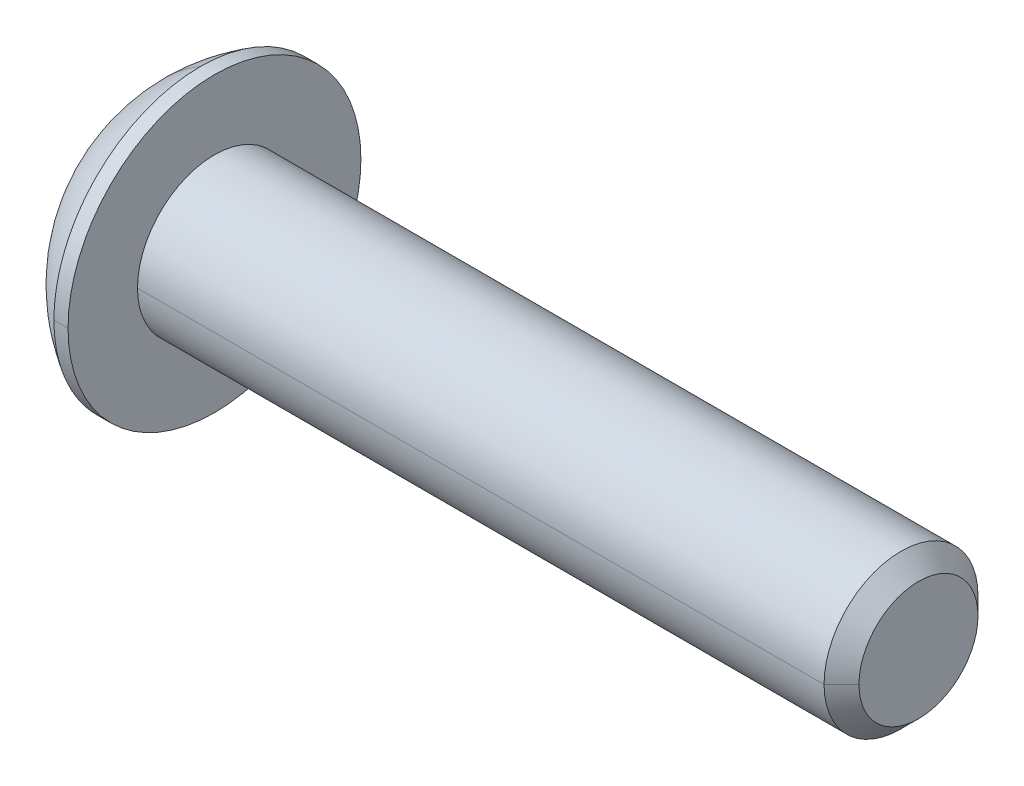
ISO-10303-21;
HEADER;
FILE_DESCRIPTION(('STEP AP214'),'2;1');
FILE_NAME('part.step','',(''),(''),'','','');
FILE_SCHEMA(('AUTOMOTIVE_DESIGN { 1 0 10303 214 1 1 1 1 }'));
ENDSEC;
DATA;
#1=APPLICATION_CONTEXT('core data for automotive mechanical design processes');
#2=APPLICATION_PROTOCOL_DEFINITION('international standard','automotive_design',2000,#1);
#3=PRODUCT_CONTEXT('',#1,'mechanical');
#4=PRODUCT('Part','Part','',(#3));
#5=PRODUCT_RELATED_PRODUCT_CATEGORY('part','',(#4));
#6=PRODUCT_DEFINITION_FORMATION('','',#4);
#7=PRODUCT_DEFINITION_CONTEXT('part definition',#1,'design');
#8=PRODUCT_DEFINITION('design','',#6,#7);
#9=PRODUCT_DEFINITION_SHAPE('','',#8);
#10=(LENGTH_UNIT() NAMED_UNIT(*) SI_UNIT(.MILLI.,.METRE.));
#11=(NAMED_UNIT(*) PLANE_ANGLE_UNIT() SI_UNIT($,.RADIAN.));
#12=(NAMED_UNIT(*) SI_UNIT($,.STERADIAN.) SOLID_ANGLE_UNIT());
#13=UNCERTAINTY_MEASURE_WITH_UNIT(LENGTH_MEASURE(1.E-05),#10,'distance_accuracy_value','');
#14=(GEOMETRIC_REPRESENTATION_CONTEXT(3) GLOBAL_UNCERTAINTY_ASSIGNED_CONTEXT((#13)) GLOBAL_UNIT_ASSIGNED_CONTEXT((#10,
#11,#12)) REPRESENTATION_CONTEXT('',''));
#15=CARTESIAN_POINT('',(0.,0.,0.));
#16=DIRECTION('',(0.,0.,1.));
#17=DIRECTION('',(1.,0.,0.));
#18=AXIS2_PLACEMENT_3D('',#15,#16,#17);
#19=CARTESIAN_POINT('',(21.2598,0.,0.));
#20=DIRECTION('',(-1.,0.,0.));
#21=DIRECTION('',(0.,0.,1.));
#22=AXIS2_PLACEMENT_3D('',#19,#20,#21);
#23=PLANE('',#22);
#24=CARTESIAN_POINT('',(21.2598,0.,0.));
#25=DIRECTION('',(-1.,0.,0.));
#26=DIRECTION('',(0.,0.,1.));
#27=AXIS2_PLACEMENT_3D('',#24,#25,#26);
#28=CIRCLE('',#27,1.61036);
#29=CARTESIAN_POINT('',(21.2598,0.,1.61036));
#30=VERTEX_POINT('',#29);
#31=CARTESIAN_POINT('',(21.2598,0.,-1.61036));
#32=VERTEX_POINT('',#31);
#33=EDGE_CURVE('E11',#30,#32,#28,.T.);
#34=ORIENTED_EDGE('',*,*,#33,.F.);
#35=CARTESIAN_POINT('',(21.2598,0.,0.));
#36=DIRECTION('',(-1.,0.,0.));
#37=DIRECTION('',(0.,0.,1.));
#38=AXIS2_PLACEMENT_3D('',#35,#36,#37);
#39=CIRCLE('',#38,1.61036);
#40=EDGE_CURVE('E221',#32,#30,#39,.T.);
#41=ORIENTED_EDGE('',*,*,#40,.F.);
#42=EDGE_LOOP('',(#34,#41));
#43=FACE_BOUND('',#42,.T.);
#44=ADVANCED_FACE('F17',(#43),#23,.F.);
#45=CARTESIAN_POINT('',(21.2598,0.,0.));
#46=DIRECTION('',(-1.,0.,0.));
#47=DIRECTION('',(0.,0.,1.));
#48=AXIS2_PLACEMENT_3D('',#45,#46,#47);
#49=CONICAL_SURFACE('',#48,1.61036,0.785398163397444);
#50=ORIENTED_EDGE('',*,*,#33,.T.);
#51=DIRECTION('',(-0.707106781186551,0.,-0.707106781186545));
#52=VECTOR('',#51,1.);
#53=CARTESIAN_POINT('',(21.2598,0.,-1.61036));
#54=LINE('',#53,#52);
#55=CARTESIAN_POINT('',(20.78736,0.,-2.0828));
#56=VERTEX_POINT('',#55);
#57=EDGE_CURVE('E218',#32,#56,#54,.T.);
#58=ORIENTED_EDGE('',*,*,#57,.T.);
#59=CARTESIAN_POINT('',(20.78736,0.,0.));
#60=DIRECTION('',(-1.,0.,0.));
#61=DIRECTION('',(0.,0.,1.));
#62=AXIS2_PLACEMENT_3D('',#59,#60,#61);
#63=CIRCLE('',#62,2.0828);
#64=CARTESIAN_POINT('',(20.78736,0.,2.0828));
#65=VERTEX_POINT('',#64);
#66=EDGE_CURVE('E222',#65,#56,#63,.T.);
#67=ORIENTED_EDGE('',*,*,#66,.F.);
#68=DIRECTION('',(-0.707106781186551,0.,0.707106781186545));
#69=VECTOR('',#68,1.);
#70=CARTESIAN_POINT('',(21.2598,0.,1.61036));
#71=LINE('',#70,#69);
#72=EDGE_CURVE('E28',#30,#65,#71,.T.);
#73=ORIENTED_EDGE('',*,*,#72,.F.);
#74=EDGE_LOOP('',(#50,#58,#67,#73));
#75=FACE_BOUND('',#74,.T.);
#76=ADVANCED_FACE('F402',(#75),#49,.T.);
#77=CARTESIAN_POINT('',(21.2598,0.,0.));
#78=DIRECTION('',(-1.,0.,0.));
#79=DIRECTION('',(0.,0.,1.));
#80=AXIS2_PLACEMENT_3D('',#77,#78,#79);
#81=CONICAL_SURFACE('',#80,1.61036,0.785398163397444);
#82=ORIENTED_EDGE('',*,*,#57,.F.);
#83=ORIENTED_EDGE('',*,*,#40,.T.);
#84=ORIENTED_EDGE('',*,*,#72,.T.);
#85=CARTESIAN_POINT('',(20.78736,0.,0.));
#86=DIRECTION('',(-1.,0.,0.));
#87=DIRECTION('',(0.,0.,1.));
#88=AXIS2_PLACEMENT_3D('',#85,#86,#87);
#89=CIRCLE('',#88,2.0828);
#90=EDGE_CURVE('E279',#56,#65,#89,.T.);
#91=ORIENTED_EDGE('',*,*,#90,.F.);
#92=EDGE_LOOP('',(#82,#83,#84,#91));
#93=FACE_BOUND('',#92,.T.);
#94=ADVANCED_FACE('F398',(#93),#81,.T.);
#95=CARTESIAN_POINT('',(0.,0.,0.));
#96=DIRECTION('',(-1.,0.,0.));
#97=DIRECTION('',(0.,0.,1.));
#98=AXIS2_PLACEMENT_3D('',#95,#96,#97);
#99=CYLINDRICAL_SURFACE('',#98,2.0828);
#100=ORIENTED_EDGE('',*,*,#66,.T.);
#101=DIRECTION('',(-1.,0.,0.));
#102=VECTOR('',#101,1.);
#103=CARTESIAN_POINT('',(0.,0.,-2.0828));
#104=LINE('',#103,#102);
#105=CARTESIAN_POINT('',(2.2098,0.,-2.0828));
#106=VERTEX_POINT('',#105);
#107=EDGE_CURVE('E297',#56,#106,#104,.T.);
#108=ORIENTED_EDGE('',*,*,#107,.T.);
#109=CARTESIAN_POINT('',(2.2098,0.,0.));
#110=DIRECTION('',(-1.,0.,0.));
#111=DIRECTION('',(0.,0.,1.));
#112=AXIS2_PLACEMENT_3D('',#109,#110,#111);
#113=CIRCLE('',#112,2.0828);
#114=CARTESIAN_POINT('',(2.2098,0.,2.0828));
#115=VERTEX_POINT('',#114);
#116=EDGE_CURVE('E256',#115,#106,#113,.T.);
#117=ORIENTED_EDGE('',*,*,#116,.F.);
#118=DIRECTION('',(-1.,0.,0.));
#119=VECTOR('',#118,1.);
#120=CARTESIAN_POINT('',(0.,0.,2.0828));
#121=LINE('',#120,#119);
#122=EDGE_CURVE('E249',#65,#115,#121,.T.);
#123=ORIENTED_EDGE('',*,*,#122,.F.);
#124=EDGE_LOOP('',(#100,#108,#117,#123));
#125=FACE_BOUND('',#124,.T.);
#126=ADVANCED_FACE('F405',(#125),#99,.T.);
#127=CARTESIAN_POINT('',(0.,0.,0.));
#128=DIRECTION('',(-1.,0.,0.));
#129=DIRECTION('',(0.,0.,1.));
#130=AXIS2_PLACEMENT_3D('',#127,#128,#129);
#131=CYLINDRICAL_SURFACE('',#130,2.0828);
#132=ORIENTED_EDGE('',*,*,#107,.F.);
#133=ORIENTED_EDGE('',*,*,#90,.T.);
#134=ORIENTED_EDGE('',*,*,#122,.T.);
#135=CARTESIAN_POINT('',(2.2098,0.,0.));
#136=DIRECTION('',(-1.,0.,0.));
#137=DIRECTION('',(0.,0.,1.));
#138=AXIS2_PLACEMENT_3D('',#135,#136,#137);
#139=CIRCLE('',#138,2.0828);
#140=EDGE_CURVE('E259',#106,#115,#139,.T.);
#141=ORIENTED_EDGE('',*,*,#140,.F.);
#142=EDGE_LOOP('',(#132,#133,#134,#141));
#143=FACE_BOUND('',#142,.T.);
#144=ADVANCED_FACE('F408',(#143),#131,.T.);
#145=CARTESIAN_POINT('',(2.2098,2.0828,0.));
#146=DIRECTION('',(-1.,0.,0.));
#147=DIRECTION('',(0.,0.,1.));
#148=AXIS2_PLACEMENT_3D('',#145,#146,#147);
#149=PLANE('',#148);
#150=ORIENTED_EDGE('',*,*,#116,.T.);
#151=ORIENTED_EDGE('',*,*,#140,.T.);
#152=EDGE_LOOP('',(#150,#151));
#153=FACE_BOUND('',#152,.T.);
#154=CARTESIAN_POINT('',(2.2098,0.,0.));
#155=DIRECTION('',(-1.,0.,0.));
#156=DIRECTION('',(0.,0.,1.));
#157=AXIS2_PLACEMENT_3D('',#154,#155,#156);
#158=CIRCLE('',#157,3.9624);
#159=CARTESIAN_POINT('',(2.2098,0.,3.9624));
#160=VERTEX_POINT('',#159);
#161=CARTESIAN_POINT('',(2.2098,0.,-3.9624));
#162=VERTEX_POINT('',#161);
#163=EDGE_CURVE('E255',#160,#162,#158,.T.);
#164=ORIENTED_EDGE('',*,*,#163,.F.);
#165=CARTESIAN_POINT('',(2.2098,0.,0.));
#166=DIRECTION('',(-1.,0.,0.));
#167=DIRECTION('',(0.,0.,1.));
#168=AXIS2_PLACEMENT_3D('',#165,#166,#167);
#169=CIRCLE('',#168,3.9624);
#170=EDGE_CURVE('E230',#162,#160,#169,.T.);
#171=ORIENTED_EDGE('',*,*,#170,.F.);
#172=EDGE_LOOP('',(#164,#171));
#173=FACE_BOUND('',#172,.T.);
#174=ADVANCED_FACE('F637',(#153,#173),#149,.F.);
#175=CARTESIAN_POINT('',(0.,0.,0.));
#176=DIRECTION('',(-1.,0.,0.));
#177=DIRECTION('',(0.,0.,1.));
#178=AXIS2_PLACEMENT_3D('',#175,#176,#177);
#179=CYLINDRICAL_SURFACE('',#178,3.9624);
#180=DIRECTION('',(-1.,0.,0.));
#181=VECTOR('',#180,1.);
#182=CARTESIAN_POINT('',(0.,0.,-3.9624));
#183=LINE('',#182,#181);
#184=CARTESIAN_POINT('',(1.8288,0.,-3.9624));
#185=VERTEX_POINT('',#184);
#186=EDGE_CURVE('E231',#162,#185,#183,.T.);
#187=ORIENTED_EDGE('',*,*,#186,.F.);
#188=ORIENTED_EDGE('',*,*,#170,.T.);
#189=DIRECTION('',(-1.,0.,0.));
#190=VECTOR('',#189,1.);
#191=CARTESIAN_POINT('',(0.,0.,3.9624));
#192=LINE('',#191,#190);
#193=CARTESIAN_POINT('',(1.8288,0.,3.9624));
#194=VERTEX_POINT('',#193);
#195=EDGE_CURVE('E227',#160,#194,#192,.T.);
#196=ORIENTED_EDGE('',*,*,#195,.T.);
#197=CARTESIAN_POINT('',(1.8288,0.,0.));
#198=DIRECTION('',(-1.,0.,0.));
#199=DIRECTION('',(0.,0.,1.));
#200=AXIS2_PLACEMENT_3D('',#197,#198,#199);
#201=CIRCLE('',#200,3.9624);
#202=CARTESIAN_POINT('',(1.8288,-3.9624,0.));
#203=VERTEX_POINT('',#202);
#204=EDGE_CURVE('E329',#203,#194,#201,.T.);
#205=ORIENTED_EDGE('',*,*,#204,.F.);
#206=CARTESIAN_POINT('',(1.8288,0.,0.));
#207=DIRECTION('',(-1.,0.,0.));
#208=DIRECTION('',(0.,0.,1.));
#209=AXIS2_PLACEMENT_3D('',#206,#207,#208);
#210=CIRCLE('',#209,3.9624);
#211=EDGE_CURVE('E214',#185,#203,#210,.T.);
#212=ORIENTED_EDGE('',*,*,#211,.F.);
#213=EDGE_LOOP('',(#187,#188,#196,#205,#212));
#214=FACE_BOUND('',#213,.T.);
#215=ADVANCED_FACE('F591',(#214),#179,.T.);
#216=CARTESIAN_POINT('',(0.,0.,0.));
#217=DIRECTION('',(-1.,0.,0.));
#218=DIRECTION('',(0.,0.,1.));
#219=AXIS2_PLACEMENT_3D('',#216,#217,#218);
#220=CYLINDRICAL_SURFACE('',#219,3.9624);
#221=ORIENTED_EDGE('',*,*,#163,.T.);
#222=ORIENTED_EDGE('',*,*,#186,.T.);
#223=CARTESIAN_POINT('',(1.8288,0.,0.));
#224=DIRECTION('',(-1.,0.,0.));
#225=DIRECTION('',(0.,0.,1.));
#226=AXIS2_PLACEMENT_3D('',#223,#224,#225);
#227=CIRCLE('',#226,3.9624);
#228=CARTESIAN_POINT('',(1.8288,3.9624,0.));
#229=VERTEX_POINT('',#228);
#230=EDGE_CURVE('E268',#229,#185,#227,.T.);
#231=ORIENTED_EDGE('',*,*,#230,.F.);
#232=CARTESIAN_POINT('',(1.8288,0.,0.));
#233=DIRECTION('',(-1.,0.,0.));
#234=DIRECTION('',(0.,0.,1.));
#235=AXIS2_PLACEMENT_3D('',#232,#233,#234);
#236=CIRCLE('',#235,3.9624);
#237=EDGE_CURVE('E325',#194,#229,#236,.T.);
#238=ORIENTED_EDGE('',*,*,#237,.F.);
#239=ORIENTED_EDGE('',*,*,#195,.F.);
#240=EDGE_LOOP('',(#221,#222,#231,#238,#239));
#241=FACE_BOUND('',#240,.T.);
#242=ADVANCED_FACE('F587',(#241),#220,.T.);
#243=CARTESIAN_POINT('',(1.3208,-2.06772225407573,-1.1938));
#244=DIRECTION('',(1.,0.,0.));
#245=DIRECTION('',(0.,1.,0.));
#246=AXIS2_PLACEMENT_3D('',#243,#244,#245);
#247=PLANE('',#246);
#248=CARTESIAN_POINT('',(1.3208,0.,0.));
#249=DIRECTION('',(-1.,0.,0.));
#250=DIRECTION('',(0.,0.,1.));
#251=AXIS2_PLACEMENT_3D('',#248,#249,#250);
#252=CIRCLE('',#251,1.1938);
#253=CARTESIAN_POINT('',(1.3208,-1.03386112703786,-0.5969));
#254=VERTEX_POINT('',#253);
#255=CARTESIAN_POINT('',(1.3208,-1.03386112703786,0.5969));
#256=VERTEX_POINT('',#255);
#257=EDGE_CURVE('E239',#254,#256,#252,.T.);
#258=ORIENTED_EDGE('',*,*,#257,.F.);
#259=DIRECTION('',(0.,0.5,-0.866025403784439));
#260=VECTOR('',#259,1.);
#261=CARTESIAN_POINT('',(1.3208,-0.689240751358574,-1.1938));
#262=LINE('',#261,#260);
#263=CARTESIAN_POINT('',(1.3208,-1.37848150271715,0.));
#264=VERTEX_POINT('',#263);
#265=EDGE_CURVE('E232',#264,#254,#262,.T.);
#266=ORIENTED_EDGE('',*,*,#265,.F.);
#267=DIRECTION('',(0.,-0.5,-0.866025403784439));
#268=VECTOR('',#267,1.);
#269=CARTESIAN_POINT('',(1.3208,-1.37848150271715,0.));
#270=LINE('',#269,#268);
#271=EDGE_CURVE('E125',#256,#264,#270,.T.);
#272=ORIENTED_EDGE('',*,*,#271,.F.);
#273=EDGE_LOOP('',(#258,#266,#272));
#274=FACE_BOUND('',#273,.T.);
#275=ADVANCED_FACE('F561',(#274),#247,.F.);
#276=CARTESIAN_POINT('',(1.3208,-2.06772225407573,-1.1938));
#277=DIRECTION('',(1.,0.,0.));
#278=DIRECTION('',(0.,1.,0.));
#279=AXIS2_PLACEMENT_3D('',#276,#277,#278);
#280=PLANE('',#279);
#281=CARTESIAN_POINT('',(1.3208,0.,0.));
#282=DIRECTION('',(-1.,0.,0.));
#283=DIRECTION('',(0.,0.,1.));
#284=AXIS2_PLACEMENT_3D('',#281,#282,#283);
#285=CIRCLE('',#284,1.1938);
#286=CARTESIAN_POINT('',(1.3208,0.,1.1938));
#287=VERTEX_POINT('',#286);
#288=EDGE_CURVE('E235',#256,#287,#285,.T.);
#289=ORIENTED_EDGE('',*,*,#288,.F.);
#290=DIRECTION('',(0.,-0.5,-0.866025403784439));
#291=VECTOR('',#290,1.);
#292=CARTESIAN_POINT('',(1.3208,-1.37848150271715,0.));
#293=LINE('',#292,#291);
#294=CARTESIAN_POINT('',(1.3208,-0.689240751358574,1.1938));
#295=VERTEX_POINT('',#294);
#296=EDGE_CURVE('E275',#295,#256,#293,.T.);
#297=ORIENTED_EDGE('',*,*,#296,.F.);
#298=DIRECTION('',(0.,-1.,0.));
#299=VECTOR('',#298,1.);
#300=CARTESIAN_POINT('',(1.3208,-0.689240751358574,1.1938));
#301=LINE('',#300,#299);
#302=EDGE_CURVE('E264',#287,#295,#301,.T.);
#303=ORIENTED_EDGE('',*,*,#302,.F.);
#304=EDGE_LOOP('',(#289,#297,#303));
#305=FACE_BOUND('',#304,.T.);
#306=ADVANCED_FACE('F557',(#305),#280,.F.);
#307=CARTESIAN_POINT('',(1.3208,-0.689240751358574,1.1938));
#308=DIRECTION('',(0.,0.,-1.));
#309=DIRECTION('',(-1.,0.,0.));
#310=AXIS2_PLACEMENT_3D('',#307,#308,#309);
#311=PLANE('',#310);
#312=DIRECTION('',(0.,-1.,0.));
#313=VECTOR('',#312,1.);
#314=CARTESIAN_POINT('',(1.3208,-0.689240751358574,1.1938));
#315=LINE('',#314,#313);
#316=CARTESIAN_POINT('',(1.3208,0.689240751358576,1.1938));
#317=VERTEX_POINT('',#316);
#318=EDGE_CURVE('E321',#317,#287,#315,.T.);
#319=ORIENTED_EDGE('',*,*,#318,.T.);
#320=ORIENTED_EDGE('',*,*,#302,.T.);
#321=DIRECTION('',(-1.,0.,0.));
#322=VECTOR('',#321,1.);
#323=CARTESIAN_POINT('',(1.3208,-0.689240751358574,1.1938));
#324=LINE('',#323,#322);
#325=CARTESIAN_POINT('',(0.,-0.689240751358574,1.1938));
#326=VERTEX_POINT('',#325);
#327=EDGE_CURVE('E267',#295,#326,#324,.T.);
#328=ORIENTED_EDGE('',*,*,#327,.T.);
#329=DIRECTION('',(0.,-1.,0.));
#330=VECTOR('',#329,1.);
#331=CARTESIAN_POINT('',(0.,-0.689240751358574,1.1938));
#332=LINE('',#331,#330);
#333=CARTESIAN_POINT('',(0.,0.689240751358576,1.1938));
#334=VERTEX_POINT('',#333);
#335=EDGE_CURVE('E217',#334,#326,#332,.T.);
#336=ORIENTED_EDGE('',*,*,#335,.F.);
#337=DIRECTION('',(-1.,0.,0.));
#338=VECTOR('',#337,1.);
#339=CARTESIAN_POINT('',(1.3208,0.689240751358576,1.1938));
#340=LINE('',#339,#338);
#341=EDGE_CURVE('E244',#317,#334,#340,.T.);
#342=ORIENTED_EDGE('',*,*,#341,.F.);
#343=EDGE_LOOP('',(#319,#320,#328,#336,#342));
#344=FACE_BOUND('',#343,.T.);
#345=ADVANCED_FACE('F367',(#344),#311,.T.);
#346=CARTESIAN_POINT('',(1.3208,-1.37848150271715,0.));
#347=DIRECTION('',(0.,0.866025403784439,-0.5));
#348=DIRECTION('',(-1.,0.,0.));
#349=AXIS2_PLACEMENT_3D('',#346,#347,#348);
#350=PLANE('',#349);
#351=ORIENTED_EDGE('',*,*,#296,.T.);
#352=ORIENTED_EDGE('',*,*,#271,.T.);
#353=DIRECTION('',(-1.,0.,0.));
#354=VECTOR('',#353,1.);
#355=CARTESIAN_POINT('',(1.3208,-1.37848150271715,0.));
#356=LINE('',#355,#354);
#357=CARTESIAN_POINT('',(0.,-1.37848150271715,0.));
#358=VERTEX_POINT('',#357);
#359=EDGE_CURVE('E377',#264,#358,#356,.T.);
#360=ORIENTED_EDGE('',*,*,#359,.T.);
#361=DIRECTION('',(0.,-0.5,-0.866025403784439));
#362=VECTOR('',#361,1.);
#363=CARTESIAN_POINT('',(0.,-1.37848150271715,0.));
#364=LINE('',#363,#362);
#365=EDGE_CURVE('E183',#326,#358,#364,.T.);
#366=ORIENTED_EDGE('',*,*,#365,.F.);
#367=ORIENTED_EDGE('',*,*,#327,.F.);
#368=EDGE_LOOP('',(#351,#352,#360,#366,#367));
#369=FACE_BOUND('',#368,.T.);
#370=ADVANCED_FACE('F609',(#369),#350,.T.);
#371=CARTESIAN_POINT('',(4.13385,0.,0.));
#372=DIRECTION('',(0.,0.,-1.));
#373=DIRECTION('',(0.,1.,0.));
#374=AXIS2_PLACEMENT_3D('',#371,#372,#373);
#375=SPHERICAL_SURFACE('',#374,4.58408870578439);
#376=ORIENTED_EDGE('',*,*,#230,.T.);
#377=ORIENTED_EDGE('',*,*,#211,.T.);
#378=CARTESIAN_POINT('',(4.13385,0.,0.));
#379=DIRECTION('',(0.,0.,-1.));
#380=DIRECTION('',(0.,1.,0.));
#381=AXIS2_PLACEMENT_3D('',#378,#379,#380);
#382=CIRCLE('',#381,4.58408870578439);
#383=CARTESIAN_POINT('',(0.,-1.9812,0.));
#384=VERTEX_POINT('',#383);
#385=EDGE_CURVE('E336',#203,#384,#382,.T.);
#386=ORIENTED_EDGE('',*,*,#385,.T.);
#387=CARTESIAN_POINT('',(0.,0.,0.));
#388=DIRECTION('',(-1.,0.,0.));
#389=DIRECTION('',(0.,0.,1.));
#390=AXIS2_PLACEMENT_3D('',#387,#388,#389);
#391=CIRCLE('',#390,1.9812);
#392=CARTESIAN_POINT('',(0.,1.9812,0.));
#393=VERTEX_POINT('',#392);
#394=EDGE_CURVE('E196',#393,#384,#391,.T.);
#395=ORIENTED_EDGE('',*,*,#394,.F.);
#396=CARTESIAN_POINT('',(4.13385,0.,0.));
#397=DIRECTION('',(0.,0.,1.));
#398=DIRECTION('',(1.,0.,0.));
#399=AXIS2_PLACEMENT_3D('',#396,#397,#398);
#400=CIRCLE('',#399,4.58408870578439);
#401=EDGE_CURVE('E272',#229,#393,#400,.T.);
#402=ORIENTED_EDGE('',*,*,#401,.F.);
#403=EDGE_LOOP('',(#376,#377,#386,#395,#402));
#404=FACE_BOUND('',#403,.T.);
#405=ADVANCED_FACE('F604',(#404),#375,.T.);
#406=CARTESIAN_POINT('',(4.13385,0.,0.));
#407=DIRECTION('',(0.,0.,-1.));
#408=DIRECTION('',(0.,1.,0.));
#409=AXIS2_PLACEMENT_3D('',#406,#407,#408);
#410=SPHERICAL_SURFACE('',#409,4.58408870578439);
#411=ORIENTED_EDGE('',*,*,#385,.F.);
#412=ORIENTED_EDGE('',*,*,#204,.T.);
#413=ORIENTED_EDGE('',*,*,#237,.T.);
#414=ORIENTED_EDGE('',*,*,#401,.T.);
#415=CARTESIAN_POINT('',(0.,0.,0.));
#416=DIRECTION('',(-1.,0.,0.));
#417=DIRECTION('',(0.,0.,1.));
#418=AXIS2_PLACEMENT_3D('',#415,#416,#417);
#419=CIRCLE('',#418,1.9812);
#420=EDGE_CURVE('E223',#384,#393,#419,.T.);
#421=ORIENTED_EDGE('',*,*,#420,.F.);
#422=EDGE_LOOP('',(#411,#412,#413,#414,#421));
#423=FACE_BOUND('',#422,.T.);
#424=ADVANCED_FACE('F608',(#423),#410,.T.);
#425=CARTESIAN_POINT('',(1.3208,-2.06772225407573,-1.1938));
#426=DIRECTION('',(1.,0.,0.));
#427=DIRECTION('',(0.,1.,0.));
#428=AXIS2_PLACEMENT_3D('',#425,#426,#427);
#429=PLANE('',#428);
#430=CARTESIAN_POINT('',(1.3208,0.,0.));
#431=DIRECTION('',(-1.,0.,0.));
#432=DIRECTION('',(0.,0.,1.));
#433=AXIS2_PLACEMENT_3D('',#430,#431,#432);
#434=CIRCLE('',#433,1.1938);
#435=CARTESIAN_POINT('',(1.3208,0.,-1.1938));
#436=VERTEX_POINT('',#435);
#437=EDGE_CURVE('E21',#436,#254,#434,.T.);
#438=ORIENTED_EDGE('',*,*,#437,.F.);
#439=DIRECTION('',(0.,1.,0.));
#440=VECTOR('',#439,1.);
#441=CARTESIAN_POINT('',(1.3208,0.689240751358577,-1.1938));
#442=LINE('',#441,#440);
#443=CARTESIAN_POINT('',(1.3208,-0.689240751358574,-1.1938));
#444=VERTEX_POINT('',#443);
#445=EDGE_CURVE('E203',#444,#436,#442,.T.);
#446=ORIENTED_EDGE('',*,*,#445,.F.);
#447=DIRECTION('',(0.,0.5,-0.866025403784439));
#448=VECTOR('',#447,1.);
#449=CARTESIAN_POINT('',(1.3208,-0.689240751358574,-1.1938));
#450=LINE('',#449,#448);
#451=EDGE_CURVE('E191',#254,#444,#450,.T.);
#452=ORIENTED_EDGE('',*,*,#451,.F.);
#453=EDGE_LOOP('',(#438,#446,#452));
#454=FACE_BOUND('',#453,.T.);
#455=ADVANCED_FACE('F553',(#454),#429,.F.);
#456=CARTESIAN_POINT('',(1.3208,-0.689240751358574,-1.1938));
#457=DIRECTION('',(0.,0.866025403784439,0.5));
#458=DIRECTION('',(1.,0.,0.));
#459=AXIS2_PLACEMENT_3D('',#456,#457,#458);
#460=PLANE('',#459);
#461=ORIENTED_EDGE('',*,*,#265,.T.);
#462=ORIENTED_EDGE('',*,*,#451,.T.);
#463=DIRECTION('',(-1.,0.,0.));
#464=VECTOR('',#463,1.);
#465=CARTESIAN_POINT('',(1.3208,-0.689240751358574,-1.1938));
#466=LINE('',#465,#464);
#467=CARTESIAN_POINT('',(0.,-0.689240751358574,-1.1938));
#468=VERTEX_POINT('',#467);
#469=EDGE_CURVE('E189',#444,#468,#466,.T.);
#470=ORIENTED_EDGE('',*,*,#469,.T.);
#471=DIRECTION('',(0.,0.5,-0.866025403784439));
#472=VECTOR('',#471,1.);
#473=CARTESIAN_POINT('',(0.,-0.689240751358574,-1.1938));
#474=LINE('',#473,#472);
#475=EDGE_CURVE('E173',#358,#468,#474,.T.);
#476=ORIENTED_EDGE('',*,*,#475,.F.);
#477=ORIENTED_EDGE('',*,*,#359,.F.);
#478=EDGE_LOOP('',(#461,#462,#470,#476,#477));
#479=FACE_BOUND('',#478,.T.);
#480=ADVANCED_FACE('F19',(#479),#460,.T.);
#481=CARTESIAN_POINT('',(-997.989959248641,0.,0.));
#482=DIRECTION('',(-1.,0.,0.));
#483=DIRECTION('',(0.,0.,1.));
#484=AXIS2_PLACEMENT_3D('',#481,#482,#483);
#485=CONICAL_SURFACE('',#484,1732.05080756886,1.0471975511966);
#486=DIRECTION('',(-0.5,0.,0.866025403784436));
#487=VECTOR('',#486,1.);
#488=CARTESIAN_POINT('',(2.01004075135859,0.,0.));
#489=LINE('',#488,#487);
#490=CARTESIAN_POINT('',(2.01004075135859,0.,0.));
#491=VERTEX_POINT('',#490);
#492=EDGE_CURVE('E284',#491,#287,#489,.T.);
#493=ORIENTED_EDGE('',*,*,#492,.F.);
#494=DIRECTION('',(-0.5,0.,-0.866025403784436));
#495=VECTOR('',#494,1.);
#496=CARTESIAN_POINT('',(2.01004075135859,0.,0.));
#497=LINE('',#496,#495);
#498=EDGE_CURVE('E315',#491,#436,#497,.T.);
#499=ORIENTED_EDGE('',*,*,#498,.T.);
#500=ORIENTED_EDGE('',*,*,#437,.T.);
#501=ORIENTED_EDGE('',*,*,#257,.T.);
#502=ORIENTED_EDGE('',*,*,#288,.T.);
#503=EDGE_LOOP('',(#493,#499,#500,#501,#502));
#504=FACE_BOUND('',#503,.T.);
#505=ADVANCED_FACE('F552',(#504),#485,.F.);
#506=CARTESIAN_POINT('',(1.3208,-2.06772225407573,-1.1938));
#507=DIRECTION('',(1.,0.,0.));
#508=DIRECTION('',(0.,1.,0.));
#509=AXIS2_PLACEMENT_3D('',#506,#507,#508);
#510=PLANE('',#509);
#511=CARTESIAN_POINT('',(1.3208,0.,0.));
#512=DIRECTION('',(-1.,0.,0.));
#513=DIRECTION('',(0.,0.,1.));
#514=AXIS2_PLACEMENT_3D('',#511,#512,#513);
#515=CIRCLE('',#514,1.1938);
#516=CARTESIAN_POINT('',(1.3208,1.03386112703786,0.5969));
#517=VERTEX_POINT('',#516);
#518=EDGE_CURVE('E280',#287,#517,#515,.T.);
#519=ORIENTED_EDGE('',*,*,#518,.F.);
#520=ORIENTED_EDGE('',*,*,#318,.F.);
#521=DIRECTION('',(0.,-0.5,0.866025403784439));
#522=VECTOR('',#521,1.);
#523=CARTESIAN_POINT('',(1.3208,0.689240751358576,1.1938));
#524=LINE('',#523,#522);
#525=EDGE_CURVE('E240',#517,#317,#524,.T.);
#526=ORIENTED_EDGE('',*,*,#525,.F.);
#527=EDGE_LOOP('',(#519,#520,#526));
#528=FACE_BOUND('',#527,.T.);
#529=ADVANCED_FACE('F653',(#528),#510,.F.);
#530=CARTESIAN_POINT('',(1.3208,0.689240751358576,1.1938));
#531=DIRECTION('',(0.,-0.866025403784439,-0.5));
#532=DIRECTION('',(0.,0.5,-0.866025403784439));
#533=AXIS2_PLACEMENT_3D('',#530,#531,#532);
#534=PLANE('',#533);
#535=DIRECTION('',(0.,-0.5,0.866025403784439));
#536=VECTOR('',#535,1.);
#537=CARTESIAN_POINT('',(1.3208,0.689240751358576,1.1938));
#538=LINE('',#537,#536);
#539=CARTESIAN_POINT('',(1.3208,1.37848150271715,0.));
#540=VERTEX_POINT('',#539);
#541=EDGE_CURVE('E245',#540,#517,#538,.T.);
#542=ORIENTED_EDGE('',*,*,#541,.T.);
#543=ORIENTED_EDGE('',*,*,#525,.T.);
#544=ORIENTED_EDGE('',*,*,#341,.T.);
#545=DIRECTION('',(0.,-0.5,0.866025403784439));
#546=VECTOR('',#545,1.);
#547=CARTESIAN_POINT('',(0.,0.689240751358576,1.1938));
#548=LINE('',#547,#546);
#549=CARTESIAN_POINT('',(0.,1.37848150271715,0.));
#550=VERTEX_POINT('',#549);
#551=EDGE_CURVE('E186',#550,#334,#548,.T.);
#552=ORIENTED_EDGE('',*,*,#551,.F.);
#553=DIRECTION('',(-1.,0.,0.));
#554=VECTOR('',#553,1.);
#555=CARTESIAN_POINT('',(1.3208,1.37848150271715,0.));
#556=LINE('',#555,#554);
#557=EDGE_CURVE('E304',#540,#550,#556,.T.);
#558=ORIENTED_EDGE('',*,*,#557,.F.);
#559=EDGE_LOOP('',(#542,#543,#544,#552,#558));
#560=FACE_BOUND('',#559,.T.);
#561=ADVANCED_FACE('F657',(#560),#534,.T.);
#562=CARTESIAN_POINT('',(1.3208,-2.06772225407573,-1.1938));
#563=DIRECTION('',(1.,0.,0.));
#564=DIRECTION('',(0.,1.,0.));
#565=AXIS2_PLACEMENT_3D('',#562,#563,#564);
#566=PLANE('',#565);
#567=CARTESIAN_POINT('',(1.3208,0.,0.));
#568=DIRECTION('',(-1.,0.,0.));
#569=DIRECTION('',(0.,0.,1.));
#570=AXIS2_PLACEMENT_3D('',#567,#568,#569);
#571=CIRCLE('',#570,1.1938);
#572=CARTESIAN_POINT('',(1.3208,1.03386112703786,-0.5969));
#573=VERTEX_POINT('',#572);
#574=EDGE_CURVE('E210',#517,#573,#571,.T.);
#575=ORIENTED_EDGE('',*,*,#574,.F.);
#576=ORIENTED_EDGE('',*,*,#541,.F.);
#577=DIRECTION('',(0.,0.5,0.866025403784439));
#578=VECTOR('',#577,1.);
#579=CARTESIAN_POINT('',(1.3208,1.37848150271715,0.));
#580=LINE('',#579,#578);
#581=EDGE_CURVE('E309',#573,#540,#580,.T.);
#582=ORIENTED_EDGE('',*,*,#581,.F.);
#583=EDGE_LOOP('',(#575,#576,#582));
#584=FACE_BOUND('',#583,.T.);
#585=ADVANCED_FACE('F618',(#584),#566,.F.);
#586=CARTESIAN_POINT('',(0.,0.,0.));
#587=DIRECTION('',(-1.,0.,0.));
#588=DIRECTION('',(0.,0.,1.));
#589=AXIS2_PLACEMENT_3D('',#586,#587,#588);
#590=PLANE('',#589);
#591=ORIENTED_EDGE('',*,*,#335,.T.);
#592=ORIENTED_EDGE('',*,*,#365,.T.);
#593=ORIENTED_EDGE('',*,*,#475,.T.);
#594=DIRECTION('',(0.,1.,0.));
#595=VECTOR('',#594,1.);
#596=CARTESIAN_POINT('',(0.,0.689240751358577,-1.1938));
#597=LINE('',#596,#595);
#598=CARTESIAN_POINT('',(0.,0.689240751358577,-1.1938));
#599=VERTEX_POINT('',#598);
#600=EDGE_CURVE('E180',#468,#599,#597,.T.);
#601=ORIENTED_EDGE('',*,*,#600,.T.);
#602=DIRECTION('',(0.,0.5,0.866025403784439));
#603=VECTOR('',#602,1.);
#604=CARTESIAN_POINT('',(0.,1.37848150271715,0.));
#605=LINE('',#604,#603);
#606=EDGE_CURVE('E308',#599,#550,#605,.T.);
#607=ORIENTED_EDGE('',*,*,#606,.T.);
#608=ORIENTED_EDGE('',*,*,#551,.T.);
#609=EDGE_LOOP('',(#591,#592,#593,#601,#607,#608));
#610=FACE_BOUND('',#609,.T.);
#611=ORIENTED_EDGE('',*,*,#394,.T.);
#612=ORIENTED_EDGE('',*,*,#420,.T.);
#613=EDGE_LOOP('',(#611,#612));
#614=FACE_BOUND('',#613,.T.);
#615=ADVANCED_FACE('F176',(#610,#614),#590,.T.);
#616=CARTESIAN_POINT('',(1.3208,0.689240751358577,-1.1938));
#617=DIRECTION('',(0.,0.,1.));
#618=DIRECTION('',(1.,0.,0.));
#619=AXIS2_PLACEMENT_3D('',#616,#617,#618);
#620=PLANE('',#619);
#621=ORIENTED_EDGE('',*,*,#445,.T.);
#622=DIRECTION('',(0.,1.,0.));
#623=VECTOR('',#622,1.);
#624=CARTESIAN_POINT('',(1.3208,0.689240751358577,-1.1938));
#625=LINE('',#624,#623);
#626=CARTESIAN_POINT('',(1.3208,0.689240751358577,-1.1938));
#627=VERTEX_POINT('',#626);
#628=EDGE_CURVE('E292',#436,#627,#625,.T.);
#629=ORIENTED_EDGE('',*,*,#628,.T.);
#630=DIRECTION('',(-1.,0.,0.));
#631=VECTOR('',#630,1.);
#632=CARTESIAN_POINT('',(1.3208,0.689240751358577,-1.1938));
#633=LINE('',#632,#631);
#634=EDGE_CURVE('E200',#627,#599,#633,.T.);
#635=ORIENTED_EDGE('',*,*,#634,.T.);
#636=ORIENTED_EDGE('',*,*,#600,.F.);
#637=ORIENTED_EDGE('',*,*,#469,.F.);
#638=EDGE_LOOP('',(#621,#629,#635,#636,#637));
#639=FACE_BOUND('',#638,.T.);
#640=ADVANCED_FACE('F198',(#639),#620,.T.);
#641=CARTESIAN_POINT('',(-997.989959248641,0.,0.));
#642=DIRECTION('',(-1.,0.,0.));
#643=DIRECTION('',(0.,0.,1.));
#644=AXIS2_PLACEMENT_3D('',#641,#642,#643);
#645=CONICAL_SURFACE('',#644,1732.05080756886,1.0471975511966);
#646=ORIENTED_EDGE('',*,*,#498,.F.);
#647=ORIENTED_EDGE('',*,*,#492,.T.);
#648=ORIENTED_EDGE('',*,*,#518,.T.);
#649=ORIENTED_EDGE('',*,*,#574,.T.);
#650=CARTESIAN_POINT('',(1.3208,0.,0.));
#651=DIRECTION('',(-1.,0.,0.));
#652=DIRECTION('',(0.,0.,1.));
#653=AXIS2_PLACEMENT_3D('',#650,#651,#652);
#654=CIRCLE('',#653,1.1938);
#655=EDGE_CURVE('E293',#573,#436,#654,.T.);
#656=ORIENTED_EDGE('',*,*,#655,.T.);
#657=EDGE_LOOP('',(#646,#647,#648,#649,#656));
#658=FACE_BOUND('',#657,.T.);
#659=ADVANCED_FACE('F678',(#658),#645,.F.);
#660=CARTESIAN_POINT('',(1.3208,1.37848150271715,0.));
#661=DIRECTION('',(0.,-0.866025403784439,0.5));
#662=DIRECTION('',(-1.,0.,0.));
#663=AXIS2_PLACEMENT_3D('',#660,#661,#662);
#664=PLANE('',#663);
#665=DIRECTION('',(0.,0.5,0.866025403784439));
#666=VECTOR('',#665,1.);
#667=CARTESIAN_POINT('',(1.3208,1.37848150271715,0.));
#668=LINE('',#667,#666);
#669=EDGE_CURVE('E288',#627,#573,#668,.T.);
#670=ORIENTED_EDGE('',*,*,#669,.T.);
#671=ORIENTED_EDGE('',*,*,#581,.T.);
#672=ORIENTED_EDGE('',*,*,#557,.T.);
#673=ORIENTED_EDGE('',*,*,#606,.F.);
#674=ORIENTED_EDGE('',*,*,#634,.F.);
#675=EDGE_LOOP('',(#670,#671,#672,#673,#674));
#676=FACE_BOUND('',#675,.T.);
#677=ADVANCED_FACE('F359',(#676),#664,.T.);
#678=CARTESIAN_POINT('',(1.3208,-2.06772225407573,-1.1938));
#679=DIRECTION('',(1.,0.,0.));
#680=DIRECTION('',(0.,1.,0.));
#681=AXIS2_PLACEMENT_3D('',#678,#679,#680);
#682=PLANE('',#681);
#683=ORIENTED_EDGE('',*,*,#655,.F.);
#684=ORIENTED_EDGE('',*,*,#669,.F.);
#685=ORIENTED_EDGE('',*,*,#628,.F.);
#686=EDGE_LOOP('',(#683,#684,#685));
#687=FACE_BOUND('',#686,.T.);
#688=ADVANCED_FACE('F357',(#687),#682,.F.);
#689=CLOSED_SHELL('',(#44,#76,#94,#126,#144,#174,#215,#242,#275,#306,#345,#370,#405,#424,#455,
#480,#505,#529,#561,#585,#615,#640,#659,#677,#688));
#690=MANIFOLD_SOLID_BREP('B1',#689);
#691=ADVANCED_BREP_SHAPE_REPRESENTATION('',(#18,#690),#14);
#692=SHAPE_DEFINITION_REPRESENTATION(#9,#691);
ENDSEC;
END-ISO-10303-21;
